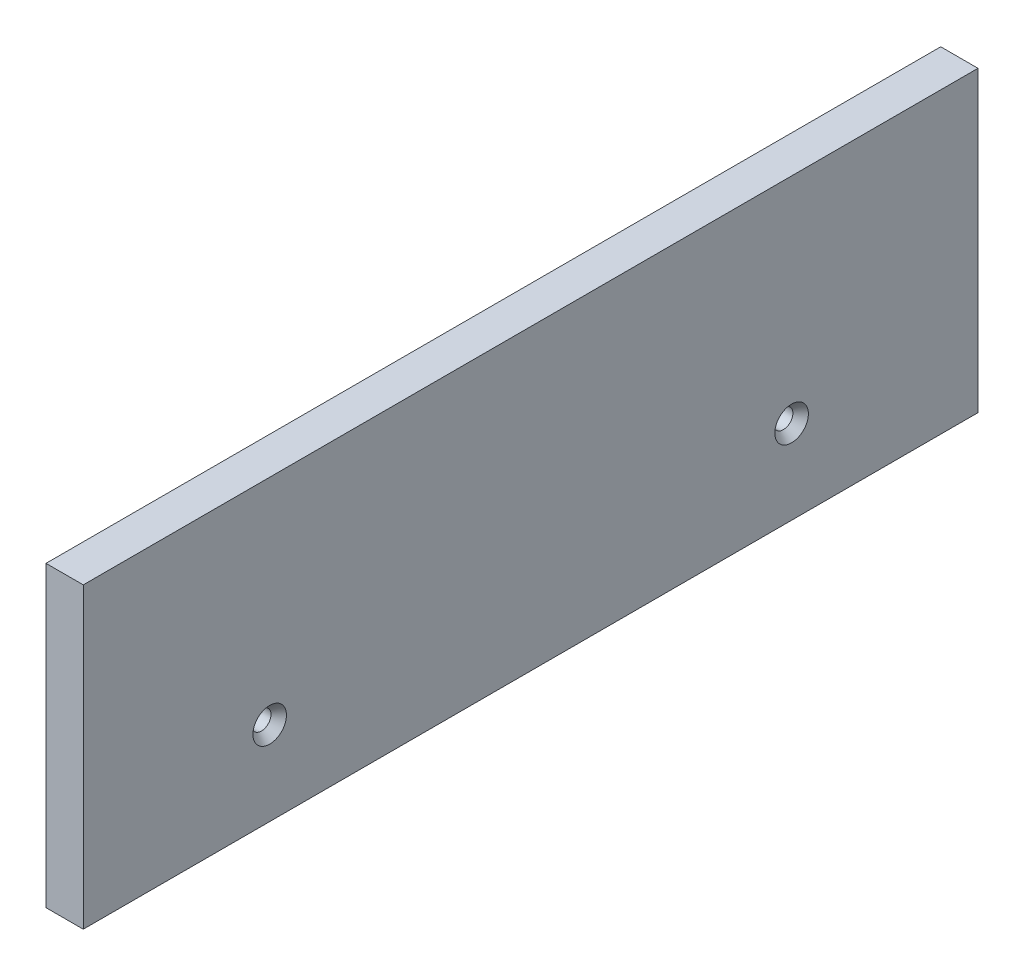
ISO-10303-21;
HEADER;
FILE_DESCRIPTION(('STEP AP214'),'2;1');
FILE_NAME('part.step','',(''),(''),'','','');
FILE_SCHEMA(('AUTOMOTIVE_DESIGN { 1 0 10303 214 1 1 1 1 }'));
ENDSEC;
DATA;
#1=APPLICATION_CONTEXT('core data for automotive mechanical design processes');
#2=APPLICATION_PROTOCOL_DEFINITION('international standard','automotive_design',2000,#1);
#3=PRODUCT_CONTEXT('',#1,'mechanical');
#4=PRODUCT('Part','Part','',(#3));
#5=PRODUCT_RELATED_PRODUCT_CATEGORY('part','',(#4));
#6=PRODUCT_DEFINITION_FORMATION('','',#4);
#7=PRODUCT_DEFINITION_CONTEXT('part definition',#1,'design');
#8=PRODUCT_DEFINITION('design','',#6,#7);
#9=PRODUCT_DEFINITION_SHAPE('','',#8);
#10=(LENGTH_UNIT() NAMED_UNIT(*) SI_UNIT(.MILLI.,.METRE.));
#11=(NAMED_UNIT(*) PLANE_ANGLE_UNIT() SI_UNIT($,.RADIAN.));
#12=(NAMED_UNIT(*) SI_UNIT($,.STERADIAN.) SOLID_ANGLE_UNIT());
#13=UNCERTAINTY_MEASURE_WITH_UNIT(LENGTH_MEASURE(1.E-05),#10,'distance_accuracy_value','');
#14=(GEOMETRIC_REPRESENTATION_CONTEXT(3) GLOBAL_UNCERTAINTY_ASSIGNED_CONTEXT((#13)) GLOBAL_UNIT_ASSIGNED_CONTEXT((#10,
#11,#12)) REPRESENTATION_CONTEXT('',''));
#15=CARTESIAN_POINT('',(0.,0.,0.));
#16=DIRECTION('',(0.,0.,1.));
#17=DIRECTION('',(1.,0.,0.));
#18=AXIS2_PLACEMENT_3D('',#15,#16,#17);
#19=CARTESIAN_POINT('',(6.35,0.,0.));
#20=DIRECTION('',(0.,0.,-1.));
#21=DIRECTION('',(-1.,0.,0.));
#22=AXIS2_PLACEMENT_3D('',#19,#20,#21);
#23=PLANE('',#22);
#24=DIRECTION('',(0.,-1.,0.));
#25=VECTOR('',#24,1.);
#26=CARTESIAN_POINT('',(0.,0.,0.));
#27=LINE('',#26,#25);
#28=CARTESIAN_POINT('',(0.,50.8,0.));
#29=VERTEX_POINT('',#28);
#30=CARTESIAN_POINT('',(0.,0.,0.));
#31=VERTEX_POINT('',#30);
#32=EDGE_CURVE('E115',#29,#31,#27,.T.);
#33=ORIENTED_EDGE('',*,*,#32,.T.);
#34=DIRECTION('',(-1.,0.,0.));
#35=VECTOR('',#34,1.);
#36=CARTESIAN_POINT('',(6.35,0.,0.));
#37=LINE('',#36,#35);
#38=CARTESIAN_POINT('',(6.35,0.,0.));
#39=VERTEX_POINT('',#38);
#40=EDGE_CURVE('E11',#39,#31,#37,.T.);
#41=ORIENTED_EDGE('',*,*,#40,.F.);
#42=DIRECTION('',(0.,-1.,0.));
#43=VECTOR('',#42,1.);
#44=CARTESIAN_POINT('',(6.35,0.,0.));
#45=LINE('',#44,#43);
#46=CARTESIAN_POINT('',(6.35,50.8,0.));
#47=VERTEX_POINT('',#46);
#48=EDGE_CURVE('E99',#47,#39,#45,.T.);
#49=ORIENTED_EDGE('',*,*,#48,.F.);
#50=DIRECTION('',(-1.,0.,0.));
#51=VECTOR('',#50,1.);
#52=CARTESIAN_POINT('',(6.35,50.8,0.));
#53=LINE('',#52,#51);
#54=EDGE_CURVE('E111',#47,#29,#53,.T.);
#55=ORIENTED_EDGE('',*,*,#54,.T.);
#56=EDGE_LOOP('',(#33,#41,#49,#55));
#57=FACE_BOUND('',#56,.T.);
#58=ADVANCED_FACE('F39',(#57),#23,.F.);
#59=CARTESIAN_POINT('',(6.35,0.,0.));
#60=DIRECTION('',(0.,1.,0.));
#61=DIRECTION('',(0.,0.,1.));
#62=AXIS2_PLACEMENT_3D('',#59,#60,#61);
#63=PLANE('',#62);
#64=DIRECTION('',(0.,0.,-1.));
#65=VECTOR('',#64,1.);
#66=CARTESIAN_POINT('',(0.,0.,0.));
#67=LINE('',#66,#65);
#68=CARTESIAN_POINT('',(0.,0.,-152.4));
#69=VERTEX_POINT('',#68);
#70=EDGE_CURVE('E104',#31,#69,#67,.T.);
#71=ORIENTED_EDGE('',*,*,#70,.T.);
#72=DIRECTION('',(-1.,0.,0.));
#73=VECTOR('',#72,1.);
#74=CARTESIAN_POINT('',(6.35,0.,-152.4));
#75=LINE('',#74,#73);
#76=CARTESIAN_POINT('',(6.35,0.,-152.4));
#77=VERTEX_POINT('',#76);
#78=EDGE_CURVE('E48',#77,#69,#75,.T.);
#79=ORIENTED_EDGE('',*,*,#78,.F.);
#80=DIRECTION('',(0.,0.,-1.));
#81=VECTOR('',#80,1.);
#82=CARTESIAN_POINT('',(6.35,0.,0.));
#83=LINE('',#82,#81);
#84=EDGE_CURVE('E94',#39,#77,#83,.T.);
#85=ORIENTED_EDGE('',*,*,#84,.F.);
#86=ORIENTED_EDGE('',*,*,#40,.T.);
#87=EDGE_LOOP('',(#71,#79,#85,#86));
#88=FACE_BOUND('',#87,.T.);
#89=ADVANCED_FACE('F103',(#88),#63,.F.);
#90=CARTESIAN_POINT('',(6.35,0.,-152.4));
#91=DIRECTION('',(0.,0.,1.));
#92=DIRECTION('',(1.,0.,0.));
#93=AXIS2_PLACEMENT_3D('',#90,#91,#92);
#94=PLANE('',#93);
#95=DIRECTION('',(0.,1.,0.));
#96=VECTOR('',#95,1.);
#97=CARTESIAN_POINT('',(0.,0.,-152.4));
#98=LINE('',#97,#96);
#99=CARTESIAN_POINT('',(0.,50.8,-152.4));
#100=VERTEX_POINT('',#99);
#101=EDGE_CURVE('E80',#69,#100,#98,.T.);
#102=ORIENTED_EDGE('',*,*,#101,.T.);
#103=DIRECTION('',(-1.,0.,0.));
#104=VECTOR('',#103,1.);
#105=CARTESIAN_POINT('',(6.35,50.8,-152.4));
#106=LINE('',#105,#104);
#107=CARTESIAN_POINT('',(6.35,50.8,-152.4));
#108=VERTEX_POINT('',#107);
#109=EDGE_CURVE('E106',#108,#100,#106,.T.);
#110=ORIENTED_EDGE('',*,*,#109,.F.);
#111=DIRECTION('',(0.,1.,0.));
#112=VECTOR('',#111,1.);
#113=CARTESIAN_POINT('',(6.35,0.,-152.4));
#114=LINE('',#113,#112);
#115=EDGE_CURVE('E97',#77,#108,#114,.T.);
#116=ORIENTED_EDGE('',*,*,#115,.F.);
#117=ORIENTED_EDGE('',*,*,#78,.T.);
#118=EDGE_LOOP('',(#102,#110,#116,#117));
#119=FACE_BOUND('',#118,.T.);
#120=ADVANCED_FACE('F107',(#119),#94,.F.);
#121=CARTESIAN_POINT('',(6.35,50.8,0.));
#122=DIRECTION('',(0.,-1.,0.));
#123=DIRECTION('',(0.,0.,-1.));
#124=AXIS2_PLACEMENT_3D('',#121,#122,#123);
#125=PLANE('',#124);
#126=DIRECTION('',(0.,0.,1.));
#127=VECTOR('',#126,1.);
#128=CARTESIAN_POINT('',(0.,50.8,0.));
#129=LINE('',#128,#127);
#130=EDGE_CURVE('E87',#100,#29,#129,.T.);
#131=ORIENTED_EDGE('',*,*,#130,.T.);
#132=ORIENTED_EDGE('',*,*,#54,.F.);
#133=DIRECTION('',(0.,0.,1.));
#134=VECTOR('',#133,1.);
#135=CARTESIAN_POINT('',(6.35,50.8,0.));
#136=LINE('',#135,#134);
#137=EDGE_CURVE('E58',#108,#47,#136,.T.);
#138=ORIENTED_EDGE('',*,*,#137,.F.);
#139=ORIENTED_EDGE('',*,*,#109,.T.);
#140=EDGE_LOOP('',(#131,#132,#138,#139));
#141=FACE_BOUND('',#140,.T.);
#142=ADVANCED_FACE('F129',(#141),#125,.F.);
#143=CARTESIAN_POINT('',(6.35,0.,0.));
#144=DIRECTION('',(-1.,0.,0.));
#145=DIRECTION('',(0.,0.,1.));
#146=AXIS2_PLACEMENT_3D('',#143,#144,#145);
#147=PLANE('',#146);
#148=CARTESIAN_POINT('',(6.35,14.2875,-31.75));
#149=DIRECTION('',(1.,0.,0.));
#150=DIRECTION('',(0.,0.,-1.));
#151=AXIS2_PLACEMENT_3D('',#148,#149,#150);
#152=CIRCLE('',#151,2.8575);
#153=CARTESIAN_POINT('',(6.35,14.2875,-34.6075));
#154=VERTEX_POINT('',#153);
#155=EDGE_CURVE('E155',#154,#154,#152,.T.);
#156=ORIENTED_EDGE('',*,*,#155,.F.);
#157=EDGE_LOOP('',(#156));
#158=FACE_BOUND('',#157,.T.);
#159=CARTESIAN_POINT('',(6.35,14.2875,-120.65));
#160=DIRECTION('',(1.,0.,0.));
#161=DIRECTION('',(0.,0.,-1.));
#162=AXIS2_PLACEMENT_3D('',#159,#160,#161);
#163=CIRCLE('',#162,2.8575);
#164=CARTESIAN_POINT('',(6.35,14.2875,-123.5075));
#165=VERTEX_POINT('',#164);
#166=EDGE_CURVE('E143',#165,#165,#163,.T.);
#167=ORIENTED_EDGE('',*,*,#166,.F.);
#168=EDGE_LOOP('',(#167));
#169=FACE_BOUND('',#168,.T.);
#170=ORIENTED_EDGE('',*,*,#48,.T.);
#171=ORIENTED_EDGE('',*,*,#84,.T.);
#172=ORIENTED_EDGE('',*,*,#115,.T.);
#173=ORIENTED_EDGE('',*,*,#137,.T.);
#174=EDGE_LOOP('',(#170,#171,#172,#173));
#175=FACE_BOUND('',#174,.T.);
#176=ADVANCED_FACE('F95',(#158,#169,#175),#147,.F.);
#177=CARTESIAN_POINT('',(0.,0.,0.));
#178=DIRECTION('',(-1.,0.,0.));
#179=DIRECTION('',(0.,0.,1.));
#180=AXIS2_PLACEMENT_3D('',#177,#178,#179);
#181=PLANE('',#180);
#182=CARTESIAN_POINT('',(0.,14.2875,-31.75));
#183=DIRECTION('',(1.,0.,0.));
#184=DIRECTION('',(0.,0.,-1.));
#185=AXIS2_PLACEMENT_3D('',#182,#183,#184);
#186=CIRCLE('',#185,1.63194999999999);
#187=CARTESIAN_POINT('',(0.,14.2875,-33.38195));
#188=VERTEX_POINT('',#187);
#189=EDGE_CURVE('E147',#188,#188,#186,.T.);
#190=ORIENTED_EDGE('',*,*,#189,.T.);
#191=EDGE_LOOP('',(#190));
#192=FACE_BOUND('',#191,.T.);
#193=CARTESIAN_POINT('',(0.,14.2875,-120.65));
#194=DIRECTION('',(1.,0.,0.));
#195=DIRECTION('',(0.,0.,-1.));
#196=AXIS2_PLACEMENT_3D('',#193,#194,#195);
#197=CIRCLE('',#196,1.63194999999999);
#198=CARTESIAN_POINT('',(0.,14.2875,-122.28195));
#199=VERTEX_POINT('',#198);
#200=EDGE_CURVE('E119',#199,#199,#197,.T.);
#201=ORIENTED_EDGE('',*,*,#200,.T.);
#202=EDGE_LOOP('',(#201));
#203=FACE_BOUND('',#202,.T.);
#204=ORIENTED_EDGE('',*,*,#32,.F.);
#205=ORIENTED_EDGE('',*,*,#130,.F.);
#206=ORIENTED_EDGE('',*,*,#101,.F.);
#207=ORIENTED_EDGE('',*,*,#70,.F.);
#208=EDGE_LOOP('',(#204,#205,#206,#207));
#209=FACE_BOUND('',#208,.T.);
#210=ADVANCED_FACE('F132',(#192,#203,#209),#181,.T.);
#211=CARTESIAN_POINT('',(6.35,14.2875,-120.65));
#212=DIRECTION('',(1.,0.,0.));
#213=DIRECTION('',(0.,0.,-1.));
#214=AXIS2_PLACEMENT_3D('',#211,#212,#213);
#215=CYLINDRICAL_SURFACE('',#214,1.63194999999999);
#216=ORIENTED_EDGE('',*,*,#200,.F.);
#217=EDGE_LOOP('',(#216));
#218=FACE_BOUND('',#217,.T.);
#219=CARTESIAN_POINT('',(4.94016599853026,14.2875,-120.65));
#220=DIRECTION('',(1.,0.,0.));
#221=DIRECTION('',(0.,0.,-1.));
#222=AXIS2_PLACEMENT_3D('',#219,#220,#221);
#223=CIRCLE('',#222,1.63194999999999);
#224=CARTESIAN_POINT('',(4.94016599853026,14.2875,-122.28195));
#225=VERTEX_POINT('',#224);
#226=EDGE_CURVE('E139',#225,#225,#223,.T.);
#227=ORIENTED_EDGE('',*,*,#226,.T.);
#228=EDGE_LOOP('',(#227));
#229=FACE_BOUND('',#228,.T.);
#230=ADVANCED_FACE('F170',(#218,#229),#215,.F.);
#231=CARTESIAN_POINT('',(6.35,14.2875,-120.65));
#232=DIRECTION('',(1.,0.,0.));
#233=DIRECTION('',(0.,0.,-1.));
#234=AXIS2_PLACEMENT_3D('',#231,#232,#233);
#235=CONICAL_SURFACE('',#234,2.8575,0.715584993317669);
#236=ORIENTED_EDGE('',*,*,#226,.F.);
#237=EDGE_LOOP('',(#236));
#238=FACE_BOUND('',#237,.T.);
#239=ORIENTED_EDGE('',*,*,#166,.T.);
#240=EDGE_LOOP('',(#239));
#241=FACE_BOUND('',#240,.T.);
#242=ADVANCED_FACE('F167',(#238,#241),#235,.F.);
#243=CARTESIAN_POINT('',(6.35,14.2875,-31.75));
#244=DIRECTION('',(1.,0.,0.));
#245=DIRECTION('',(0.,0.,-1.));
#246=AXIS2_PLACEMENT_3D('',#243,#244,#245);
#247=CYLINDRICAL_SURFACE('',#246,1.63194999999999);
#248=ORIENTED_EDGE('',*,*,#189,.F.);
#249=EDGE_LOOP('',(#248));
#250=FACE_BOUND('',#249,.T.);
#251=CARTESIAN_POINT('',(4.94016599853026,14.2875,-31.75));
#252=DIRECTION('',(1.,0.,0.));
#253=DIRECTION('',(0.,0.,-1.));
#254=AXIS2_PLACEMENT_3D('',#251,#252,#253);
#255=CIRCLE('',#254,1.63194999999999);
#256=CARTESIAN_POINT('',(4.94016599853026,14.2875,-33.38195));
#257=VERTEX_POINT('',#256);
#258=EDGE_CURVE('E151',#257,#257,#255,.T.);
#259=ORIENTED_EDGE('',*,*,#258,.T.);
#260=EDGE_LOOP('',(#259));
#261=FACE_BOUND('',#260,.T.);
#262=ADVANCED_FACE('F169',(#250,#261),#247,.F.);
#263=CARTESIAN_POINT('',(6.35,14.2875,-31.75));
#264=DIRECTION('',(1.,0.,0.));
#265=DIRECTION('',(0.,0.,-1.));
#266=AXIS2_PLACEMENT_3D('',#263,#264,#265);
#267=CONICAL_SURFACE('',#266,2.8575,0.715584993317669);
#268=ORIENTED_EDGE('',*,*,#258,.F.);
#269=EDGE_LOOP('',(#268));
#270=FACE_BOUND('',#269,.T.);
#271=ORIENTED_EDGE('',*,*,#155,.T.);
#272=EDGE_LOOP('',(#271));
#273=FACE_BOUND('',#272,.T.);
#274=ADVANCED_FACE('F160',(#270,#273),#267,.F.);
#275=CLOSED_SHELL('',(#58,#89,#120,#142,#176,#210,#230,#242,#262,#274));
#276=MANIFOLD_SOLID_BREP('B2',#275);
#277=ADVANCED_BREP_SHAPE_REPRESENTATION('',(#18,#276),#14);
#278=SHAPE_DEFINITION_REPRESENTATION(#9,#277);
ENDSEC;
END-ISO-10303-21;
